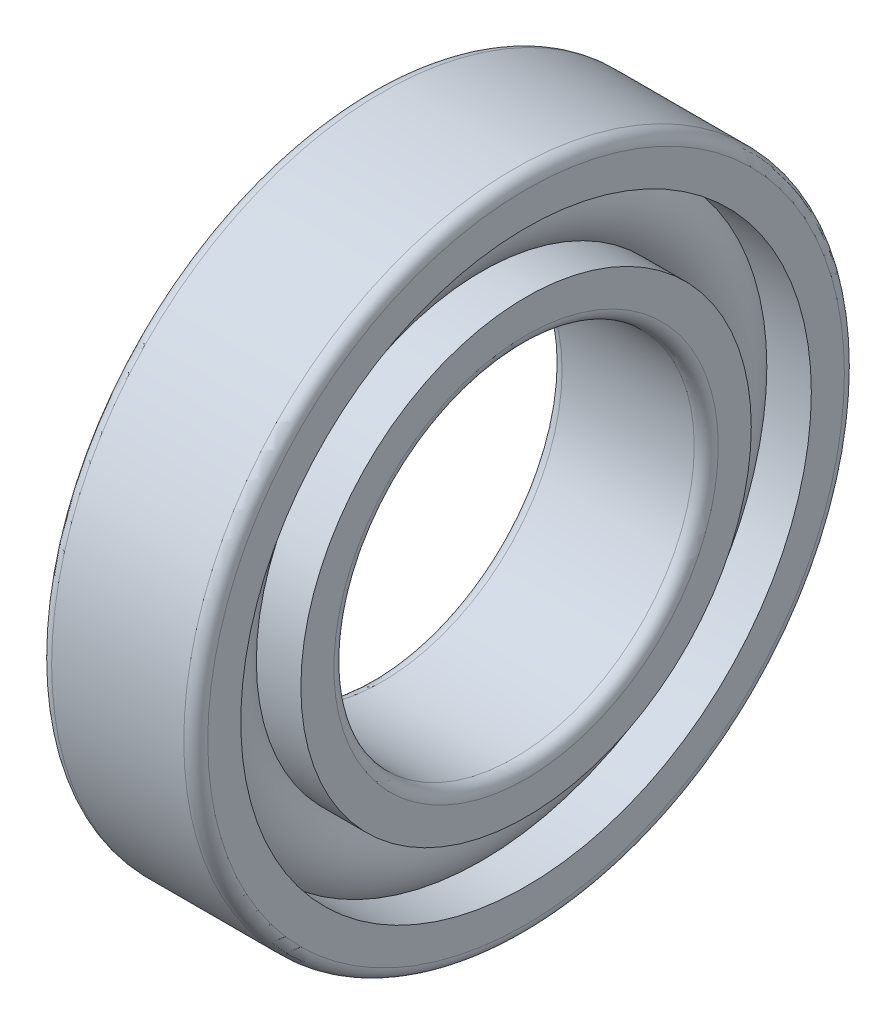
ISO-10303-21;
HEADER;
FILE_DESCRIPTION(('STEP AP214'),'2;1');
FILE_NAME('part.step','',(''),(''),'','','');
FILE_SCHEMA(('AUTOMOTIVE_DESIGN { 1 0 10303 214 1 1 1 1 }'));
ENDSEC;
DATA;
#1=APPLICATION_CONTEXT('core data for automotive mechanical design processes');
#2=APPLICATION_PROTOCOL_DEFINITION('international standard','automotive_design',2000,#1);
#3=PRODUCT_CONTEXT('',#1,'mechanical');
#4=PRODUCT('Part','Part','',(#3));
#5=PRODUCT_RELATED_PRODUCT_CATEGORY('part','',(#4));
#6=PRODUCT_DEFINITION_FORMATION('','',#4);
#7=PRODUCT_DEFINITION_CONTEXT('part definition',#1,'design');
#8=PRODUCT_DEFINITION('design','',#6,#7);
#9=PRODUCT_DEFINITION_SHAPE('','',#8);
#10=(LENGTH_UNIT() NAMED_UNIT(*) SI_UNIT(.MILLI.,.METRE.));
#11=(NAMED_UNIT(*) PLANE_ANGLE_UNIT() SI_UNIT($,.RADIAN.));
#12=(NAMED_UNIT(*) SI_UNIT($,.STERADIAN.) SOLID_ANGLE_UNIT());
#13=UNCERTAINTY_MEASURE_WITH_UNIT(LENGTH_MEASURE(1.E-05),#10,'distance_accuracy_value','');
#14=(GEOMETRIC_REPRESENTATION_CONTEXT(3) GLOBAL_UNCERTAINTY_ASSIGNED_CONTEXT((#13)) GLOBAL_UNIT_ASSIGNED_CONTEXT((#10,
#11,#12)) REPRESENTATION_CONTEXT('',''));
#15=CARTESIAN_POINT('',(0.,0.,0.));
#16=DIRECTION('',(0.,0.,1.));
#17=DIRECTION('',(1.,0.,0.));
#18=AXIS2_PLACEMENT_3D('',#15,#16,#17);
#19=CARTESIAN_POINT('',(0.,0.,0.));
#20=DIRECTION('',(-1.,0.,0.));
#21=DIRECTION('',(0.,0.,1.));
#22=AXIS2_PLACEMENT_3D('',#19,#20,#21);
#23=TOROIDAL_SURFACE('',#22,21.25,3.75);
#24=CARTESIAN_POINT('',(2.79508497187474,0.,0.));
#25=DIRECTION('',(-1.,0.,0.));
#26=DIRECTION('',(0.,0.,1.));
#27=AXIS2_PLACEMENT_3D('',#24,#25,#26);
#28=CIRCLE('',#27,23.75);
#29=CARTESIAN_POINT('',(2.79508497187474,0.,23.75));
#30=VERTEX_POINT('',#29);
#31=EDGE_CURVE('E41',#30,#30,#28,.F.);
#32=ORIENTED_EDGE('',*,*,#31,.T.);
#33=EDGE_LOOP('',(#32));
#34=FACE_BOUND('',#33,.T.);
#35=CARTESIAN_POINT('',(2.79508497187473,0.,0.));
#36=DIRECTION('',(-1.,0.,0.));
#37=DIRECTION('',(0.,0.,1.));
#38=AXIS2_PLACEMENT_3D('',#35,#36,#37);
#39=CIRCLE('',#38,18.75);
#40=CARTESIAN_POINT('',(2.79508497187473,0.,18.75));
#41=VERTEX_POINT('',#40);
#42=EDGE_CURVE('E10',#41,#41,#39,.T.);
#43=ORIENTED_EDGE('',*,*,#42,.T.);
#44=EDGE_LOOP('',(#43));
#45=FACE_BOUND('',#44,.T.);
#46=ADVANCED_FACE('F37',(#34,#45),#23,.T.);
#47=CARTESIAN_POINT('',(-20.6375,0.,0.));
#48=DIRECTION('',(1.,0.,0.));
#49=DIRECTION('',(0.,0.,-1.));
#50=AXIS2_PLACEMENT_3D('',#47,#48,#49);
#51=CYLINDRICAL_SURFACE('',#50,18.75);
#52=CARTESIAN_POINT('',(6.5,0.,0.));
#53=DIRECTION('',(1.,0.,0.));
#54=DIRECTION('',(0.,0.,-1.));
#55=AXIS2_PLACEMENT_3D('',#52,#53,#54);
#56=CIRCLE('',#55,18.75);
#57=CARTESIAN_POINT('',(6.5,0.,-18.75));
#58=VERTEX_POINT('',#57);
#59=EDGE_CURVE('E50',#58,#58,#56,.T.);
#60=ORIENTED_EDGE('',*,*,#59,.F.);
#61=EDGE_LOOP('',(#60));
#62=FACE_BOUND('',#61,.T.);
#63=ORIENTED_EDGE('',*,*,#42,.F.);
#64=EDGE_LOOP('',(#63));
#65=FACE_BOUND('',#64,.T.);
#66=ADVANCED_FACE('F89',(#62,#65),#51,.T.);
#67=CARTESIAN_POINT('',(-20.6375,0.,0.));
#68=DIRECTION('',(1.,0.,0.));
#69=DIRECTION('',(0.,0.,-1.));
#70=AXIS2_PLACEMENT_3D('',#67,#68,#69);
#71=CYLINDRICAL_SURFACE('',#70,18.75);
#72=CARTESIAN_POINT('',(-6.5,0.,0.));
#73=DIRECTION('',(1.,0.,0.));
#74=DIRECTION('',(0.,0.,-1.));
#75=AXIS2_PLACEMENT_3D('',#72,#73,#74);
#76=CIRCLE('',#75,18.75);
#77=CARTESIAN_POINT('',(-6.5,0.,-18.75));
#78=VERTEX_POINT('',#77);
#79=EDGE_CURVE('E59',#78,#78,#76,.T.);
#80=ORIENTED_EDGE('',*,*,#79,.T.);
#81=EDGE_LOOP('',(#80));
#82=FACE_BOUND('',#81,.T.);
#83=CARTESIAN_POINT('',(-2.79508497187473,0.,0.));
#84=DIRECTION('',(1.,0.,0.));
#85=DIRECTION('',(0.,0.,-1.));
#86=AXIS2_PLACEMENT_3D('',#83,#84,#85);
#87=CIRCLE('',#86,18.75);
#88=CARTESIAN_POINT('',(-2.79508497187473,0.,-18.75));
#89=VERTEX_POINT('',#88);
#90=EDGE_CURVE('E45',#89,#89,#87,.T.);
#91=ORIENTED_EDGE('',*,*,#90,.F.);
#92=EDGE_LOOP('',(#91));
#93=FACE_BOUND('',#92,.T.);
#94=ADVANCED_FACE('F92',(#82,#93),#71,.T.);
#95=CARTESIAN_POINT('',(6.5,16.,0.));
#96=DIRECTION('',(1.,0.,0.));
#97=DIRECTION('',(0.,0.,-1.));
#98=AXIS2_PLACEMENT_3D('',#95,#96,#97);
#99=PLANE('',#98);
#100=ORIENTED_EDGE('',*,*,#59,.T.);
#101=EDGE_LOOP('',(#100));
#102=FACE_BOUND('',#101,.T.);
#103=CARTESIAN_POINT('',(6.5,0.,0.));
#104=DIRECTION('',(1.,0.,0.));
#105=DIRECTION('',(0.,0.,-1.));
#106=AXIS2_PLACEMENT_3D('',#103,#104,#105);
#107=CIRCLE('',#106,16.);
#108=CARTESIAN_POINT('',(6.5,0.,-16.));
#109=VERTEX_POINT('',#108);
#110=EDGE_CURVE('E81',#109,#109,#107,.T.);
#111=ORIENTED_EDGE('',*,*,#110,.F.);
#112=EDGE_LOOP('',(#111));
#113=FACE_BOUND('',#112,.T.);
#114=ADVANCED_FACE('F86',(#102,#113),#99,.T.);
#115=CARTESIAN_POINT('',(5.5,0.,0.));
#116=DIRECTION('',(1.,0.,0.));
#117=DIRECTION('',(0.,0.,-1.));
#118=AXIS2_PLACEMENT_3D('',#115,#116,#117);
#119=TOROIDAL_SURFACE('',#118,16.,1.);
#120=ORIENTED_EDGE('',*,*,#110,.T.);
#121=EDGE_LOOP('',(#120));
#122=FACE_BOUND('',#121,.T.);
#123=CARTESIAN_POINT('',(5.5,0.,0.));
#124=DIRECTION('',(1.,0.,0.));
#125=DIRECTION('',(0.,0.,-1.));
#126=AXIS2_PLACEMENT_3D('',#123,#124,#125);
#127=CIRCLE('',#126,15.);
#128=CARTESIAN_POINT('',(5.5,0.,-15.));
#129=VERTEX_POINT('',#128);
#130=EDGE_CURVE('E78',#129,#129,#127,.T.);
#131=ORIENTED_EDGE('',*,*,#130,.F.);
#132=EDGE_LOOP('',(#131));
#133=FACE_BOUND('',#132,.T.);
#134=ADVANCED_FACE('F103',(#122,#133),#119,.T.);
#135=CARTESIAN_POINT('',(-20.6375,0.,0.));
#136=DIRECTION('',(1.,0.,0.));
#137=DIRECTION('',(0.,0.,-1.));
#138=AXIS2_PLACEMENT_3D('',#135,#136,#137);
#139=CYLINDRICAL_SURFACE('',#138,15.);
#140=ORIENTED_EDGE('',*,*,#130,.T.);
#141=EDGE_LOOP('',(#140));
#142=FACE_BOUND('',#141,.T.);
#143=CARTESIAN_POINT('',(-5.5,0.,0.));
#144=DIRECTION('',(1.,0.,0.));
#145=DIRECTION('',(0.,0.,-1.));
#146=AXIS2_PLACEMENT_3D('',#143,#144,#145);
#147=CIRCLE('',#146,15.);
#148=CARTESIAN_POINT('',(-5.5,0.,-15.));
#149=VERTEX_POINT('',#148);
#150=EDGE_CURVE('E75',#149,#149,#147,.T.);
#151=ORIENTED_EDGE('',*,*,#150,.F.);
#152=EDGE_LOOP('',(#151));
#153=FACE_BOUND('',#152,.T.);
#154=ADVANCED_FACE('F106',(#142,#153),#139,.F.);
#155=CARTESIAN_POINT('',(-5.5,0.,0.));
#156=DIRECTION('',(1.,0.,0.));
#157=DIRECTION('',(0.,0.,-1.));
#158=AXIS2_PLACEMENT_3D('',#155,#156,#157);
#159=TOROIDAL_SURFACE('',#158,16.,1.);
#160=ORIENTED_EDGE('',*,*,#150,.T.);
#161=EDGE_LOOP('',(#160));
#162=FACE_BOUND('',#161,.T.);
#163=CARTESIAN_POINT('',(-6.5,0.,0.));
#164=DIRECTION('',(1.,0.,0.));
#165=DIRECTION('',(0.,0.,-1.));
#166=AXIS2_PLACEMENT_3D('',#163,#164,#165);
#167=CIRCLE('',#166,16.);
#168=CARTESIAN_POINT('',(-6.5,0.,-16.));
#169=VERTEX_POINT('',#168);
#170=EDGE_CURVE('E72',#169,#169,#167,.T.);
#171=ORIENTED_EDGE('',*,*,#170,.F.);
#172=EDGE_LOOP('',(#171));
#173=FACE_BOUND('',#172,.T.);
#174=ADVANCED_FACE('F110',(#162,#173),#159,.T.);
#175=CARTESIAN_POINT('',(-6.5,18.75,0.));
#176=DIRECTION('',(-1.,0.,0.));
#177=DIRECTION('',(0.,0.,1.));
#178=AXIS2_PLACEMENT_3D('',#175,#176,#177);
#179=PLANE('',#178);
#180=ORIENTED_EDGE('',*,*,#170,.T.);
#181=EDGE_LOOP('',(#180));
#182=FACE_BOUND('',#181,.T.);
#183=ORIENTED_EDGE('',*,*,#79,.F.);
#184=EDGE_LOOP('',(#183));
#185=FACE_BOUND('',#184,.T.);
#186=ADVANCED_FACE('F114',(#182,#185),#179,.T.);
#187=CARTESIAN_POINT('',(-2.79508497187474,0.,0.));
#188=DIRECTION('',(1.,0.,0.));
#189=DIRECTION('',(0.,0.,-1.));
#190=AXIS2_PLACEMENT_3D('',#187,#188,#189);
#191=CIRCLE('',#190,23.75);
#192=CARTESIAN_POINT('',(-2.79508497187474,0.,-23.75));
#193=VERTEX_POINT('',#192);
#194=EDGE_CURVE('E53',#193,#193,#191,.F.);
#195=ORIENTED_EDGE('',*,*,#194,.T.);
#196=EDGE_LOOP('',(#195));
#197=FACE_BOUND('',#196,.T.);
#198=ORIENTED_EDGE('',*,*,#90,.T.);
#199=EDGE_LOOP('',(#198));
#200=FACE_BOUND('',#199,.T.);
#201=ADVANCED_FACE('F39',(#197,#200),#23,.T.);
#202=CARTESIAN_POINT('',(-20.6375,0.,0.));
#203=DIRECTION('',(1.,0.,0.));
#204=DIRECTION('',(0.,0.,-1.));
#205=AXIS2_PLACEMENT_3D('',#202,#203,#204);
#206=CYLINDRICAL_SURFACE('',#205,23.75);
#207=CARTESIAN_POINT('',(6.5,0.,0.));
#208=DIRECTION('',(1.,0.,0.));
#209=DIRECTION('',(0.,0.,-1.));
#210=AXIS2_PLACEMENT_3D('',#207,#208,#209);
#211=CIRCLE('',#210,23.75);
#212=CARTESIAN_POINT('',(6.5,0.,-23.75));
#213=VERTEX_POINT('',#212);
#214=EDGE_CURVE('E55',#213,#213,#211,.T.);
#215=ORIENTED_EDGE('',*,*,#214,.T.);
#216=EDGE_LOOP('',(#215));
#217=FACE_BOUND('',#216,.T.);
#218=ORIENTED_EDGE('',*,*,#31,.F.);
#219=EDGE_LOOP('',(#218));
#220=FACE_BOUND('',#219,.T.);
#221=ADVANCED_FACE('F119',(#217,#220),#206,.F.);
#222=CARTESIAN_POINT('',(-20.6375,0.,0.));
#223=DIRECTION('',(1.,0.,0.));
#224=DIRECTION('',(0.,0.,-1.));
#225=AXIS2_PLACEMENT_3D('',#222,#223,#224);
#226=CYLINDRICAL_SURFACE('',#225,23.75);
#227=CARTESIAN_POINT('',(-6.5,0.,0.));
#228=DIRECTION('',(1.,0.,0.));
#229=DIRECTION('',(0.,0.,-1.));
#230=AXIS2_PLACEMENT_3D('',#227,#228,#229);
#231=CIRCLE('',#230,23.75);
#232=CARTESIAN_POINT('',(-6.5,0.,-23.75));
#233=VERTEX_POINT('',#232);
#234=EDGE_CURVE('E150',#233,#233,#231,.T.);
#235=ORIENTED_EDGE('',*,*,#234,.F.);
#236=EDGE_LOOP('',(#235));
#237=FACE_BOUND('',#236,.T.);
#238=ORIENTED_EDGE('',*,*,#194,.F.);
#239=EDGE_LOOP('',(#238));
#240=FACE_BOUND('',#239,.T.);
#241=ADVANCED_FACE('F122',(#237,#240),#226,.F.);
#242=CARTESIAN_POINT('',(6.5,26.5,0.));
#243=DIRECTION('',(1.,0.,0.));
#244=DIRECTION('',(0.,0.,-1.));
#245=AXIS2_PLACEMENT_3D('',#242,#243,#244);
#246=PLANE('',#245);
#247=CARTESIAN_POINT('',(6.5,0.,0.));
#248=DIRECTION('',(1.,0.,0.));
#249=DIRECTION('',(0.,0.,-1.));
#250=AXIS2_PLACEMENT_3D('',#247,#248,#249);
#251=CIRCLE('',#250,26.5);
#252=CARTESIAN_POINT('',(6.5,0.,-26.5));
#253=VERTEX_POINT('',#252);
#254=EDGE_CURVE('E61',#253,#253,#251,.T.);
#255=ORIENTED_EDGE('',*,*,#254,.T.);
#256=EDGE_LOOP('',(#255));
#257=FACE_BOUND('',#256,.T.);
#258=ORIENTED_EDGE('',*,*,#214,.F.);
#259=EDGE_LOOP('',(#258));
#260=FACE_BOUND('',#259,.T.);
#261=ADVANCED_FACE('F123',(#257,#260),#246,.T.);
#262=CARTESIAN_POINT('',(5.5,0.,0.));
#263=DIRECTION('',(1.,0.,0.));
#264=DIRECTION('',(0.,0.,-1.));
#265=AXIS2_PLACEMENT_3D('',#262,#263,#264);
#266=TOROIDAL_SURFACE('',#265,26.5,1.);
#267=CARTESIAN_POINT('',(5.5,0.,0.));
#268=DIRECTION('',(1.,0.,0.));
#269=DIRECTION('',(0.,0.,-1.));
#270=AXIS2_PLACEMENT_3D('',#267,#268,#269);
#271=CIRCLE('',#270,27.5);
#272=CARTESIAN_POINT('',(5.5,0.,-27.5));
#273=VERTEX_POINT('',#272);
#274=EDGE_CURVE('E66',#273,#273,#271,.T.);
#275=ORIENTED_EDGE('',*,*,#274,.T.);
#276=EDGE_LOOP('',(#275));
#277=FACE_BOUND('',#276,.T.);
#278=ORIENTED_EDGE('',*,*,#254,.F.);
#279=EDGE_LOOP('',(#278));
#280=FACE_BOUND('',#279,.T.);
#281=ADVANCED_FACE('F126',(#277,#280),#266,.T.);
#282=CARTESIAN_POINT('',(-20.6375,0.,0.));
#283=DIRECTION('',(1.,0.,0.));
#284=DIRECTION('',(0.,0.,-1.));
#285=AXIS2_PLACEMENT_3D('',#282,#283,#284);
#286=CYLINDRICAL_SURFACE('',#285,27.5);
#287=CARTESIAN_POINT('',(-5.5,0.,0.));
#288=DIRECTION('',(1.,0.,0.));
#289=DIRECTION('',(0.,0.,-1.));
#290=AXIS2_PLACEMENT_3D('',#287,#288,#289);
#291=CIRCLE('',#290,27.5);
#292=CARTESIAN_POINT('',(-5.5,0.,-27.5));
#293=VERTEX_POINT('',#292);
#294=EDGE_CURVE('E154',#293,#293,#291,.T.);
#295=ORIENTED_EDGE('',*,*,#294,.T.);
#296=EDGE_LOOP('',(#295));
#297=FACE_BOUND('',#296,.T.);
#298=ORIENTED_EDGE('',*,*,#274,.F.);
#299=EDGE_LOOP('',(#298));
#300=FACE_BOUND('',#299,.T.);
#301=ADVANCED_FACE('F130',(#297,#300),#286,.T.);
#302=CARTESIAN_POINT('',(-5.5,0.,0.));
#303=DIRECTION('',(1.,0.,0.));
#304=DIRECTION('',(0.,0.,-1.));
#305=AXIS2_PLACEMENT_3D('',#302,#303,#304);
#306=TOROIDAL_SURFACE('',#305,26.5,1.);
#307=CARTESIAN_POINT('',(-6.5,0.,0.));
#308=DIRECTION('',(1.,0.,0.));
#309=DIRECTION('',(0.,0.,-1.));
#310=AXIS2_PLACEMENT_3D('',#307,#308,#309);
#311=CIRCLE('',#310,26.5);
#312=CARTESIAN_POINT('',(-6.5,0.,-26.5));
#313=VERTEX_POINT('',#312);
#314=EDGE_CURVE('E151',#313,#313,#311,.T.);
#315=ORIENTED_EDGE('',*,*,#314,.T.);
#316=EDGE_LOOP('',(#315));
#317=FACE_BOUND('',#316,.T.);
#318=ORIENTED_EDGE('',*,*,#294,.F.);
#319=EDGE_LOOP('',(#318));
#320=FACE_BOUND('',#319,.T.);
#321=ADVANCED_FACE('F134',(#317,#320),#306,.T.);
#322=CARTESIAN_POINT('',(-6.5,23.75,0.));
#323=DIRECTION('',(-1.,0.,0.));
#324=DIRECTION('',(0.,0.,1.));
#325=AXIS2_PLACEMENT_3D('',#322,#323,#324);
#326=PLANE('',#325);
#327=ORIENTED_EDGE('',*,*,#234,.T.);
#328=EDGE_LOOP('',(#327));
#329=FACE_BOUND('',#328,.T.);
#330=ORIENTED_EDGE('',*,*,#314,.F.);
#331=EDGE_LOOP('',(#330));
#332=FACE_BOUND('',#331,.T.);
#333=ADVANCED_FACE('F138',(#329,#332),#326,.T.);
#334=CLOSED_SHELL('',(#46,#66,#94,#114,#134,#154,#174,#186,#201,#221,#241,#261,#281,#301,#321,#333));
#335=MANIFOLD_SOLID_BREP('B2',#334);
#336=ADVANCED_BREP_SHAPE_REPRESENTATION('',(#18,#335),#14);
#337=SHAPE_DEFINITION_REPRESENTATION(#9,#336);
ENDSEC;
END-ISO-10303-21;
